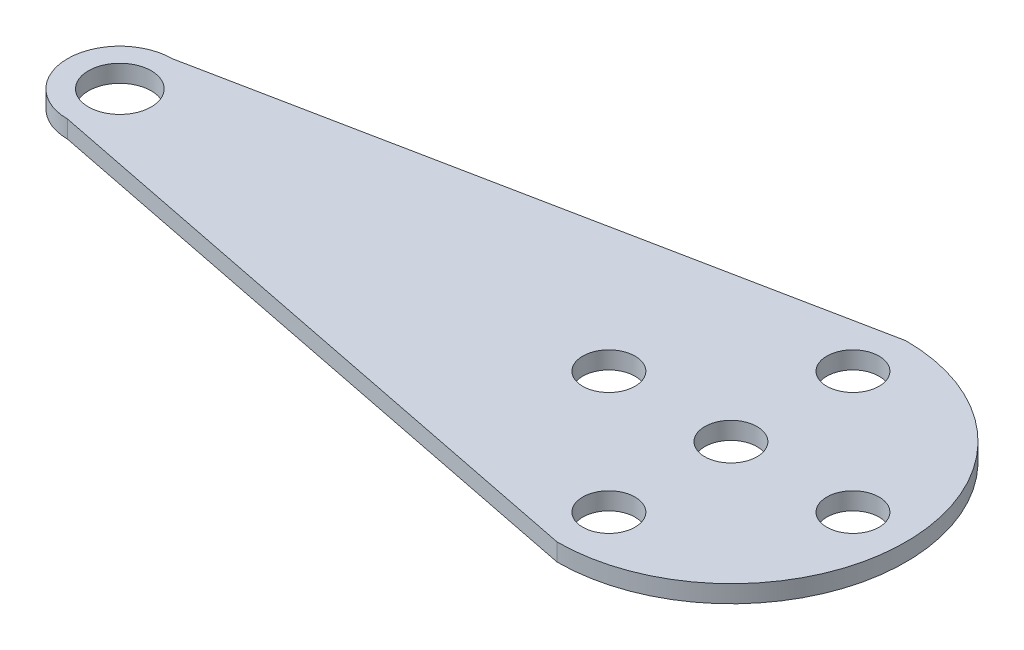
ISO-10303-21;
HEADER;
FILE_DESCRIPTION(('STEP AP214'),'2;1');
FILE_NAME('part.step','',(''),(''),'','','');
FILE_SCHEMA(('AUTOMOTIVE_DESIGN { 1 0 10303 214 1 1 1 1 }'));
ENDSEC;
DATA;
#1=APPLICATION_CONTEXT('core data for automotive mechanical design processes');
#2=APPLICATION_PROTOCOL_DEFINITION('international standard','automotive_design',2000,#1);
#3=PRODUCT_CONTEXT('',#1,'mechanical');
#4=PRODUCT('Part','Part','',(#3));
#5=PRODUCT_RELATED_PRODUCT_CATEGORY('part','',(#4));
#6=PRODUCT_DEFINITION_FORMATION('','',#4);
#7=PRODUCT_DEFINITION_CONTEXT('part definition',#1,'design');
#8=PRODUCT_DEFINITION('design','',#6,#7);
#9=PRODUCT_DEFINITION_SHAPE('','',#8);
#10=(LENGTH_UNIT() NAMED_UNIT(*) SI_UNIT(.MILLI.,.METRE.));
#11=(NAMED_UNIT(*) PLANE_ANGLE_UNIT() SI_UNIT($,.RADIAN.));
#12=(NAMED_UNIT(*) SI_UNIT($,.STERADIAN.) SOLID_ANGLE_UNIT());
#13=UNCERTAINTY_MEASURE_WITH_UNIT(LENGTH_MEASURE(1.E-05),#10,'distance_accuracy_value','');
#14=(GEOMETRIC_REPRESENTATION_CONTEXT(3) GLOBAL_UNCERTAINTY_ASSIGNED_CONTEXT((#13)) GLOBAL_UNIT_ASSIGNED_CONTEXT((#10,
#11,#12)) REPRESENTATION_CONTEXT('',''));
#15=CARTESIAN_POINT('',(0.,0.,0.));
#16=DIRECTION('',(0.,0.,1.));
#17=DIRECTION('',(1.,0.,0.));
#18=AXIS2_PLACEMENT_3D('',#15,#16,#17);
#19=CARTESIAN_POINT('',(-35.05,1.,0.));
#20=DIRECTION('',(0.,-1.,0.));
#21=DIRECTION('',(0.,0.,-1.));
#22=AXIS2_PLACEMENT_3D('',#19,#20,#21);
#23=CYLINDRICAL_SURFACE('',#22,3.);
#24=CARTESIAN_POINT('',(-35.05,0.,0.));
#25=DIRECTION('',(0.,1.,0.));
#26=DIRECTION('',(0.,0.,1.));
#27=AXIS2_PLACEMENT_3D('',#24,#25,#26);
#28=CIRCLE('',#27,3.);
#29=CARTESIAN_POINT('',(-35.05,0.,-2.99999999999996));
#30=VERTEX_POINT('',#29);
#31=CARTESIAN_POINT('',(-35.0500000000001,0.,3.00000000000005));
#32=VERTEX_POINT('',#31);
#33=EDGE_CURVE('E114',#30,#32,#28,.T.);
#34=ORIENTED_EDGE('',*,*,#33,.T.);
#35=DIRECTION('',(0.,-1.,0.));
#36=VECTOR('',#35,1.);
#37=CARTESIAN_POINT('',(-35.0500000000001,1.,3.00000000000005));
#38=LINE('',#37,#36);
#39=CARTESIAN_POINT('',(-35.0500000000001,1.,3.00000000000005));
#40=VERTEX_POINT('',#39);
#41=EDGE_CURVE('E11',#40,#32,#38,.T.);
#42=ORIENTED_EDGE('',*,*,#41,.F.);
#43=CARTESIAN_POINT('',(-35.05,1.,0.));
#44=DIRECTION('',(0.,1.,0.));
#45=DIRECTION('',(0.,0.,1.));
#46=AXIS2_PLACEMENT_3D('',#43,#44,#45);
#47=CIRCLE('',#46,3.);
#48=CARTESIAN_POINT('',(-35.05,1.,-2.99999999999996));
#49=VERTEX_POINT('',#48);
#50=EDGE_CURVE('E87',#49,#40,#47,.T.);
#51=ORIENTED_EDGE('',*,*,#50,.F.);
#52=DIRECTION('',(0.,-1.,0.));
#53=VECTOR('',#52,1.);
#54=CARTESIAN_POINT('',(-35.05,1.,-2.99999999999996));
#55=LINE('',#54,#53);
#56=EDGE_CURVE('E113',#49,#30,#55,.T.);
#57=ORIENTED_EDGE('',*,*,#56,.T.);
#58=EDGE_LOOP('',(#34,#42,#51,#57));
#59=FACE_BOUND('',#58,.T.);
#60=ADVANCED_FACE('F44',(#59),#23,.T.);
#61=CARTESIAN_POINT('',(-1.90646731951253,1.,9.58931776533383));
#62=DIRECTION('',(-0.194995221272856,0.,0.980804192324212));
#63=DIRECTION('',(0.980804192324212,0.,0.194995221272856));
#64=AXIS2_PLACEMENT_3D('',#61,#62,#63);
#65=PLANE('',#64);
#66=DIRECTION('',(-0.980804192324212,0.,-0.194995221272856));
#67=VECTOR('',#66,1.);
#68=CARTESIAN_POINT('',(-1.90646731951253,0.,9.58931776533383));
#69=LINE('',#68,#67);
#70=CARTESIAN_POINT('',(0.00311481186088085,0.,9.96896478678821));
#71=VERTEX_POINT('',#70);
#72=EDGE_CURVE('E97',#71,#32,#69,.T.);
#73=ORIENTED_EDGE('',*,*,#72,.F.);
#74=DIRECTION('',(0.,-1.,0.));
#75=VECTOR('',#74,1.);
#76=CARTESIAN_POINT('',(0.00311481186088085,1.,9.96896478678821));
#77=LINE('',#76,#75);
#78=CARTESIAN_POINT('',(0.00311481186088085,1.,9.96896478678821));
#79=VERTEX_POINT('',#78);
#80=EDGE_CURVE('E53',#79,#71,#77,.T.);
#81=ORIENTED_EDGE('',*,*,#80,.F.);
#82=DIRECTION('',(-0.980804192324212,0.,-0.194995221272856));
#83=VECTOR('',#82,1.);
#84=CARTESIAN_POINT('',(-1.90646731951253,1.,9.58931776533383));
#85=LINE('',#84,#83);
#86=EDGE_CURVE('E95',#79,#40,#85,.T.);
#87=ORIENTED_EDGE('',*,*,#86,.T.);
#88=ORIENTED_EDGE('',*,*,#41,.T.);
#89=EDGE_LOOP('',(#73,#81,#87,#88));
#90=FACE_BOUND('',#89,.T.);
#91=ADVANCED_FACE('F94',(#90),#65,.T.);
#92=CARTESIAN_POINT('',(0.00311481186088085,1.,-0.0310352132117933));
#93=DIRECTION('',(0.,-1.,0.));
#94=DIRECTION('',(0.,0.,-1.));
#95=AXIS2_PLACEMENT_3D('',#92,#93,#94);
#96=CYLINDRICAL_SURFACE('',#95,10.);
#97=CARTESIAN_POINT('',(0.00311481186088085,0.,-0.0310352132117933));
#98=DIRECTION('',(0.,1.,0.));
#99=DIRECTION('',(0.,0.,1.));
#100=AXIS2_PLACEMENT_3D('',#97,#98,#99);
#101=CIRCLE('',#100,10.);
#102=CARTESIAN_POINT('',(0.00311481186088085,0.,-10.0310352132118));
#103=VERTEX_POINT('',#102);
#104=EDGE_CURVE('E76',#71,#103,#101,.T.);
#105=ORIENTED_EDGE('',*,*,#104,.T.);
#106=DIRECTION('',(0.,-1.,0.));
#107=VECTOR('',#106,1.);
#108=CARTESIAN_POINT('',(0.00311481186088085,1.,-10.0310352132118));
#109=LINE('',#108,#107);
#110=CARTESIAN_POINT('',(0.00311481186088085,1.,-10.0310352132118));
#111=VERTEX_POINT('',#110);
#112=EDGE_CURVE('E99',#111,#103,#109,.T.);
#113=ORIENTED_EDGE('',*,*,#112,.F.);
#114=CARTESIAN_POINT('',(0.00311481186088085,1.,-0.0310352132117933));
#115=DIRECTION('',(0.,1.,0.));
#116=DIRECTION('',(0.,0.,1.));
#117=AXIS2_PLACEMENT_3D('',#114,#115,#116);
#118=CIRCLE('',#117,10.);
#119=EDGE_CURVE('E100',#79,#111,#118,.T.);
#120=ORIENTED_EDGE('',*,*,#119,.F.);
#121=ORIENTED_EDGE('',*,*,#80,.T.);
#122=EDGE_LOOP('',(#105,#113,#120,#121));
#123=FACE_BOUND('',#122,.T.);
#124=ADVANCED_FACE('F101',(#123),#96,.T.);
#125=CARTESIAN_POINT('',(-1.93410756183096,1.,-9.64246264845243));
#126=DIRECTION('',(0.19666509584153,0.,0.980470723722867));
#127=DIRECTION('',(0.980470723722867,0.,-0.19666509584153));
#128=AXIS2_PLACEMENT_3D('',#125,#126,#127);
#129=PLANE('',#128);
#130=DIRECTION('',(-0.980470723722867,0.,0.196665095841529));
#131=VECTOR('',#130,1.);
#132=CARTESIAN_POINT('',(-1.93410756183096,0.,-9.64246264845243));
#133=LINE('',#132,#131);
#134=EDGE_CURVE('E82',#103,#30,#133,.T.);
#135=ORIENTED_EDGE('',*,*,#134,.T.);
#136=ORIENTED_EDGE('',*,*,#56,.F.);
#137=DIRECTION('',(-0.980470723722867,0.,0.196665095841529));
#138=VECTOR('',#137,1.);
#139=CARTESIAN_POINT('',(-1.93410756183096,1.,-9.64246264845243));
#140=LINE('',#139,#138);
#141=EDGE_CURVE('E61',#111,#49,#140,.T.);
#142=ORIENTED_EDGE('',*,*,#141,.F.);
#143=ORIENTED_EDGE('',*,*,#112,.T.);
#144=EDGE_LOOP('',(#135,#136,#142,#143));
#145=FACE_BOUND('',#144,.T.);
#146=ADVANCED_FACE('F128',(#145),#129,.F.);
#147=CARTESIAN_POINT('',(0.,1.,0.));
#148=DIRECTION('',(0.,1.,0.));
#149=DIRECTION('',(0.,0.,1.));
#150=AXIS2_PLACEMENT_3D('',#147,#148,#149);
#151=PLANE('',#150);
#152=CARTESIAN_POINT('',(3.95332173747447E-13,1.,-7.));
#153=DIRECTION('',(0.,1.,0.));
#154=DIRECTION('',(0.,0.,1.));
#155=AXIS2_PLACEMENT_3D('',#152,#153,#154);
#156=CIRCLE('',#155,1.50000000000042);
#157=CARTESIAN_POINT('',(3.95332173747447E-13,1.,-5.49999999999957));
#158=VERTEX_POINT('',#157);
#159=EDGE_CURVE('E118',#158,#158,#156,.T.);
#160=ORIENTED_EDGE('',*,*,#159,.F.);
#161=EDGE_LOOP('',(#160));
#162=FACE_BOUND('',#161,.T.);
#163=CARTESIAN_POINT('',(-6.9999999999998,1.,-1.98523339633126E-13));
#164=DIRECTION('',(0.,1.,0.));
#165=DIRECTION('',(0.,0.,1.));
#166=AXIS2_PLACEMENT_3D('',#163,#164,#165);
#167=CIRCLE('',#166,1.50000000000032);
#168=CARTESIAN_POINT('',(-6.9999999999998,1.,1.50000000000012));
#169=VERTEX_POINT('',#168);
#170=EDGE_CURVE('E220',#169,#169,#167,.T.);
#171=ORIENTED_EDGE('',*,*,#170,.F.);
#172=EDGE_LOOP('',(#171));
#173=FACE_BOUND('',#172,.T.);
#174=CARTESIAN_POINT('',(7.0000000000002,1.,1.97666086873723E-13));
#175=DIRECTION('',(0.,1.,0.));
#176=DIRECTION('',(0.,0.,1.));
#177=AXIS2_PLACEMENT_3D('',#174,#175,#176);
#178=CIRCLE('',#177,1.50000000000015);
#179=CARTESIAN_POINT('',(7.0000000000002,1.,1.50000000000035));
#180=VERTEX_POINT('',#179);
#181=EDGE_CURVE('E216',#180,#180,#178,.T.);
#182=ORIENTED_EDGE('',*,*,#181,.F.);
#183=EDGE_LOOP('',(#182));
#184=FACE_BOUND('',#183,.T.);
#185=CARTESIAN_POINT('',(0.,1.,7.));
#186=DIRECTION('',(0.,1.,0.));
#187=DIRECTION('',(0.,0.,1.));
#188=AXIS2_PLACEMENT_3D('',#185,#186,#187);
#189=CIRCLE('',#188,1.5);
#190=CARTESIAN_POINT('',(0.,1.,8.5));
#191=VERTEX_POINT('',#190);
#192=EDGE_CURVE('E212',#191,#191,#189,.T.);
#193=ORIENTED_EDGE('',*,*,#192,.F.);
#194=EDGE_LOOP('',(#193));
#195=FACE_BOUND('',#194,.T.);
#196=CARTESIAN_POINT('',(0.,1.,0.));
#197=DIRECTION('',(0.,1.,0.));
#198=DIRECTION('',(0.,0.,1.));
#199=AXIS2_PLACEMENT_3D('',#196,#197,#198);
#200=CIRCLE('',#199,1.5);
#201=CARTESIAN_POINT('',(0.,1.,1.5));
#202=VERTEX_POINT('',#201);
#203=EDGE_CURVE('E188',#202,#202,#200,.T.);
#204=ORIENTED_EDGE('',*,*,#203,.F.);
#205=EDGE_LOOP('',(#204));
#206=FACE_BOUND('',#205,.T.);
#207=CARTESIAN_POINT('',(-35.05,1.,0.));
#208=DIRECTION('',(0.,1.,0.));
#209=DIRECTION('',(0.,0.,1.));
#210=AXIS2_PLACEMENT_3D('',#207,#208,#209);
#211=CIRCLE('',#210,1.8);
#212=CARTESIAN_POINT('',(-35.05,1.,1.80000000000004));
#213=VERTEX_POINT('',#212);
#214=EDGE_CURVE('E182',#213,#213,#211,.T.);
#215=ORIENTED_EDGE('',*,*,#214,.F.);
#216=EDGE_LOOP('',(#215));
#217=FACE_BOUND('',#216,.T.);
#218=ORIENTED_EDGE('',*,*,#50,.T.);
#219=ORIENTED_EDGE('',*,*,#86,.F.);
#220=ORIENTED_EDGE('',*,*,#119,.T.);
#221=ORIENTED_EDGE('',*,*,#141,.T.);
#222=EDGE_LOOP('',(#218,#219,#220,#221));
#223=FACE_BOUND('',#222,.T.);
#224=ADVANCED_FACE('F104',(#162,#173,#184,#195,#206,#217,#223),#151,.T.);
#225=CARTESIAN_POINT('',(0.,0.,0.));
#226=DIRECTION('',(0.,1.,0.));
#227=DIRECTION('',(0.,0.,1.));
#228=AXIS2_PLACEMENT_3D('',#225,#226,#227);
#229=PLANE('',#228);
#230=CARTESIAN_POINT('',(3.95332173747447E-13,0.,-7.));
#231=DIRECTION('',(0.,-1.,0.));
#232=DIRECTION('',(0.,0.,-1.));
#233=AXIS2_PLACEMENT_3D('',#230,#231,#232);
#234=CIRCLE('',#233,1.50000000000042);
#235=CARTESIAN_POINT('',(3.95332173747447E-13,0.,-8.50000000000043));
#236=VERTEX_POINT('',#235);
#237=EDGE_CURVE('E180',#236,#236,#234,.T.);
#238=ORIENTED_EDGE('',*,*,#237,.F.);
#239=EDGE_LOOP('',(#238));
#240=FACE_BOUND('',#239,.T.);
#241=CARTESIAN_POINT('',(-6.9999999999998,0.,-1.98523339633126E-13));
#242=DIRECTION('',(0.,-1.,0.));
#243=DIRECTION('',(0.,0.,-1.));
#244=AXIS2_PLACEMENT_3D('',#241,#242,#243);
#245=CIRCLE('',#244,1.50000000000032);
#246=CARTESIAN_POINT('',(-6.9999999999998,0.,-1.50000000000052));
#247=VERTEX_POINT('',#246);
#248=EDGE_CURVE('E198',#247,#247,#245,.T.);
#249=ORIENTED_EDGE('',*,*,#248,.F.);
#250=EDGE_LOOP('',(#249));
#251=FACE_BOUND('',#250,.T.);
#252=CARTESIAN_POINT('',(7.0000000000002,0.,1.97666086873723E-13));
#253=DIRECTION('',(0.,-1.,0.));
#254=DIRECTION('',(0.,0.,-1.));
#255=AXIS2_PLACEMENT_3D('',#252,#253,#254);
#256=CIRCLE('',#255,1.50000000000015);
#257=CARTESIAN_POINT('',(7.0000000000002,0.,-1.49999999999996));
#258=VERTEX_POINT('',#257);
#259=EDGE_CURVE('E194',#258,#258,#256,.T.);
#260=ORIENTED_EDGE('',*,*,#259,.F.);
#261=EDGE_LOOP('',(#260));
#262=FACE_BOUND('',#261,.T.);
#263=CARTESIAN_POINT('',(0.,0.,7.));
#264=DIRECTION('',(0.,-1.,0.));
#265=DIRECTION('',(0.,0.,-1.));
#266=AXIS2_PLACEMENT_3D('',#263,#264,#265);
#267=CIRCLE('',#266,1.5);
#268=CARTESIAN_POINT('',(0.,0.,5.5));
#269=VERTEX_POINT('',#268);
#270=EDGE_CURVE('E191',#269,#269,#267,.T.);
#271=ORIENTED_EDGE('',*,*,#270,.F.);
#272=EDGE_LOOP('',(#271));
#273=FACE_BOUND('',#272,.T.);
#274=CARTESIAN_POINT('',(0.,0.,0.));
#275=DIRECTION('',(0.,-1.,0.));
#276=DIRECTION('',(0.,0.,-1.));
#277=AXIS2_PLACEMENT_3D('',#274,#275,#276);
#278=CIRCLE('',#277,1.5);
#279=CARTESIAN_POINT('',(0.,0.,-1.5));
#280=VERTEX_POINT('',#279);
#281=EDGE_CURVE('E183',#280,#280,#278,.T.);
#282=ORIENTED_EDGE('',*,*,#281,.F.);
#283=EDGE_LOOP('',(#282));
#284=FACE_BOUND('',#283,.T.);
#285=CARTESIAN_POINT('',(-35.05,0.,0.));
#286=DIRECTION('',(0.,-1.,0.));
#287=DIRECTION('',(0.,0.,-1.));
#288=AXIS2_PLACEMENT_3D('',#285,#286,#287);
#289=CIRCLE('',#288,1.8);
#290=CARTESIAN_POINT('',(-35.05,0.,-1.79999999999996));
#291=VERTEX_POINT('',#290);
#292=EDGE_CURVE('E201',#291,#291,#289,.T.);
#293=ORIENTED_EDGE('',*,*,#292,.F.);
#294=EDGE_LOOP('',(#293));
#295=FACE_BOUND('',#294,.T.);
#296=ORIENTED_EDGE('',*,*,#33,.F.);
#297=ORIENTED_EDGE('',*,*,#134,.F.);
#298=ORIENTED_EDGE('',*,*,#104,.F.);
#299=ORIENTED_EDGE('',*,*,#72,.T.);
#300=EDGE_LOOP('',(#296,#297,#298,#299));
#301=FACE_BOUND('',#300,.T.);
#302=ADVANCED_FACE('F131',(#240,#251,#262,#273,#284,#295,#301),#229,.F.);
#303=CARTESIAN_POINT('',(-35.05,11.,0.));
#304=DIRECTION('',(0.,-1.,0.));
#305=DIRECTION('',(0.,0.,-1.));
#306=AXIS2_PLACEMENT_3D('',#303,#304,#305);
#307=CYLINDRICAL_SURFACE('',#306,1.8);
#308=ORIENTED_EDGE('',*,*,#214,.T.);
#309=EDGE_LOOP('',(#308));
#310=FACE_BOUND('',#309,.T.);
#311=ORIENTED_EDGE('',*,*,#292,.T.);
#312=EDGE_LOOP('',(#311));
#313=FACE_BOUND('',#312,.T.);
#314=ADVANCED_FACE('F146',(#310,#313),#307,.F.);
#315=CARTESIAN_POINT('',(0.,11.,0.));
#316=DIRECTION('',(0.,-1.,0.));
#317=DIRECTION('',(0.,0.,-1.));
#318=AXIS2_PLACEMENT_3D('',#315,#316,#317);
#319=CYLINDRICAL_SURFACE('',#318,1.5);
#320=ORIENTED_EDGE('',*,*,#203,.T.);
#321=EDGE_LOOP('',(#320));
#322=FACE_BOUND('',#321,.T.);
#323=ORIENTED_EDGE('',*,*,#281,.T.);
#324=EDGE_LOOP('',(#323));
#325=FACE_BOUND('',#324,.T.);
#326=ADVANCED_FACE('F153',(#322,#325),#319,.F.);
#327=CARTESIAN_POINT('',(0.,11.,7.));
#328=DIRECTION('',(0.,-1.,0.));
#329=DIRECTION('',(0.,0.,-1.));
#330=AXIS2_PLACEMENT_3D('',#327,#328,#329);
#331=CYLINDRICAL_SURFACE('',#330,1.5);
#332=ORIENTED_EDGE('',*,*,#192,.T.);
#333=EDGE_LOOP('',(#332));
#334=FACE_BOUND('',#333,.T.);
#335=ORIENTED_EDGE('',*,*,#270,.T.);
#336=EDGE_LOOP('',(#335));
#337=FACE_BOUND('',#336,.T.);
#338=ADVANCED_FACE('F155',(#334,#337),#331,.F.);
#339=CARTESIAN_POINT('',(7.0000000000002,11.,1.97666086873723E-13));
#340=DIRECTION('',(0.,-1.,0.));
#341=DIRECTION('',(0.,0.,-1.));
#342=AXIS2_PLACEMENT_3D('',#339,#340,#341);
#343=CYLINDRICAL_SURFACE('',#342,1.50000000000015);
#344=ORIENTED_EDGE('',*,*,#181,.T.);
#345=EDGE_LOOP('',(#344));
#346=FACE_BOUND('',#345,.T.);
#347=ORIENTED_EDGE('',*,*,#259,.T.);
#348=EDGE_LOOP('',(#347));
#349=FACE_BOUND('',#348,.T.);
#350=ADVANCED_FACE('F158',(#346,#349),#343,.F.);
#351=CARTESIAN_POINT('',(-6.9999999999998,11.,-1.98523339633126E-13));
#352=DIRECTION('',(0.,-1.,0.));
#353=DIRECTION('',(0.,0.,-1.));
#354=AXIS2_PLACEMENT_3D('',#351,#352,#353);
#355=CYLINDRICAL_SURFACE('',#354,1.50000000000032);
#356=ORIENTED_EDGE('',*,*,#170,.T.);
#357=EDGE_LOOP('',(#356));
#358=FACE_BOUND('',#357,.T.);
#359=ORIENTED_EDGE('',*,*,#248,.T.);
#360=EDGE_LOOP('',(#359));
#361=FACE_BOUND('',#360,.T.);
#362=ADVANCED_FACE('F163',(#358,#361),#355,.F.);
#363=CARTESIAN_POINT('',(3.95332173747447E-13,11.,-7.));
#364=DIRECTION('',(0.,-1.,0.));
#365=DIRECTION('',(0.,0.,-1.));
#366=AXIS2_PLACEMENT_3D('',#363,#364,#365);
#367=CYLINDRICAL_SURFACE('',#366,1.50000000000042);
#368=ORIENTED_EDGE('',*,*,#159,.T.);
#369=EDGE_LOOP('',(#368));
#370=FACE_BOUND('',#369,.T.);
#371=ORIENTED_EDGE('',*,*,#237,.T.);
#372=EDGE_LOOP('',(#371));
#373=FACE_BOUND('',#372,.T.);
#374=ADVANCED_FACE('F166',(#370,#373),#367,.F.);
#375=CLOSED_SHELL('',(#60,#91,#124,#146,#224,#302,#314,#326,#338,#350,#362,#374));
#376=MANIFOLD_SOLID_BREP('B2',#375);
#377=ADVANCED_BREP_SHAPE_REPRESENTATION('',(#18,#376),#14);
#378=SHAPE_DEFINITION_REPRESENTATION(#9,#377);
ENDSEC;
END-ISO-10303-21;
